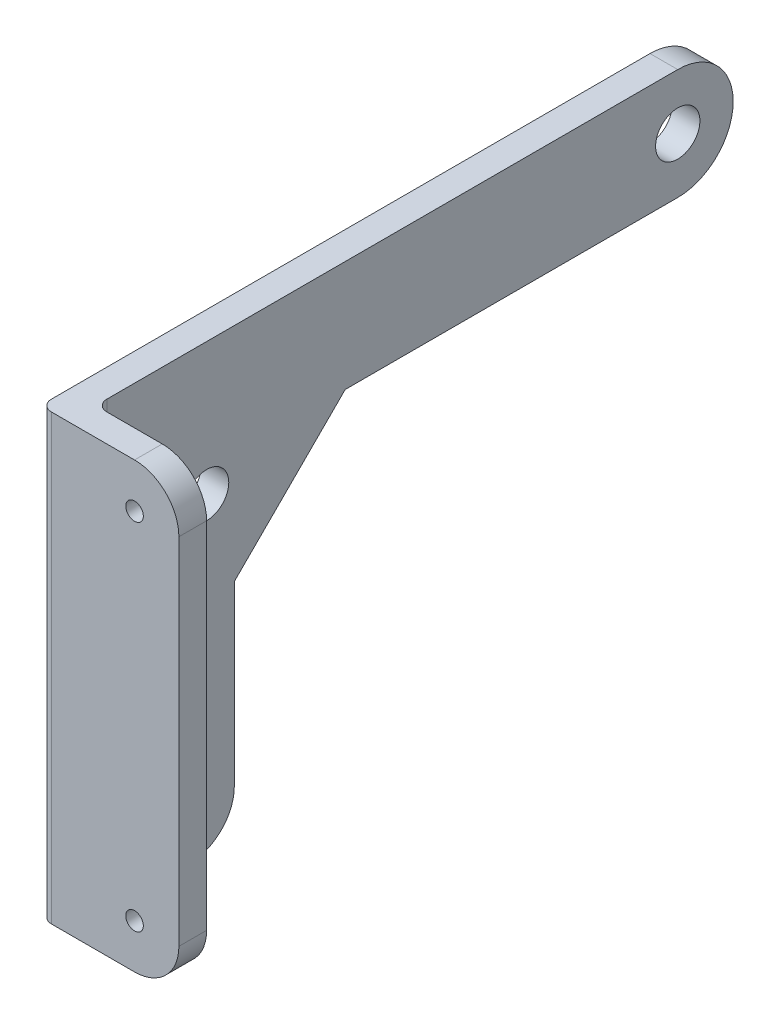
ISO-10303-21;
HEADER;
FILE_DESCRIPTION(('STEP AP214'),'2;1');
FILE_NAME('part.step','',(''),(''),'','','');
FILE_SCHEMA(('AUTOMOTIVE_DESIGN { 1 0 10303 214 1 1 1 1 }'));
ENDSEC;
DATA;
#1=APPLICATION_CONTEXT('core data for automotive mechanical design processes');
#2=APPLICATION_PROTOCOL_DEFINITION('international standard','automotive_design',2000,#1);
#3=PRODUCT_CONTEXT('',#1,'mechanical');
#4=PRODUCT('Part','Part','',(#3));
#5=PRODUCT_RELATED_PRODUCT_CATEGORY('part','',(#4));
#6=PRODUCT_DEFINITION_FORMATION('','',#4);
#7=PRODUCT_DEFINITION_CONTEXT('part definition',#1,'design');
#8=PRODUCT_DEFINITION('design','',#6,#7);
#9=PRODUCT_DEFINITION_SHAPE('','',#8);
#10=(LENGTH_UNIT() NAMED_UNIT(*) SI_UNIT(.MILLI.,.METRE.));
#11=(NAMED_UNIT(*) PLANE_ANGLE_UNIT() SI_UNIT($,.RADIAN.));
#12=(NAMED_UNIT(*) SI_UNIT($,.STERADIAN.) SOLID_ANGLE_UNIT());
#13=UNCERTAINTY_MEASURE_WITH_UNIT(LENGTH_MEASURE(1.E-05),#10,'distance_accuracy_value','');
#14=(GEOMETRIC_REPRESENTATION_CONTEXT(3) GLOBAL_UNCERTAINTY_ASSIGNED_CONTEXT((#13)) GLOBAL_UNIT_ASSIGNED_CONTEXT((#10,
#11,#12)) REPRESENTATION_CONTEXT('',''));
#15=CARTESIAN_POINT('',(0.,0.,0.));
#16=DIRECTION('',(0.,0.,1.));
#17=DIRECTION('',(1.,0.,0.));
#18=AXIS2_PLACEMENT_3D('',#15,#16,#17);
#19=CARTESIAN_POINT('',(12.5,0.,0.));
#20=DIRECTION('',(-1.,0.,0.));
#21=DIRECTION('',(0.,0.,1.));
#22=AXIS2_PLACEMENT_3D('',#19,#20,#21);
#23=PLANE('',#22);
#24=CARTESIAN_POINT('',(12.5,-70.,425.));
#25=DIRECTION('',(1.,0.,0.));
#26=DIRECTION('',(0.,0.,-1.));
#27=AXIS2_PLACEMENT_3D('',#24,#25,#26);
#28=CIRCLE('',#27,20.);
#29=CARTESIAN_POINT('',(12.5,-70.,405.));
#30=VERTEX_POINT('',#29);
#31=EDGE_CURVE('E355',#30,#30,#28,.T.);
#32=ORIENTED_EDGE('',*,*,#31,.F.);
#33=EDGE_LOOP('',(#32));
#34=FACE_BOUND('',#33,.T.);
#35=CARTESIAN_POINT('',(12.5,0.,0.));
#36=DIRECTION('',(1.,0.,0.));
#37=DIRECTION('',(0.,0.,-1.));
#38=AXIS2_PLACEMENT_3D('',#35,#36,#37);
#39=CIRCLE('',#38,20.);
#40=CARTESIAN_POINT('',(12.5,0.,-20.));
#41=VERTEX_POINT('',#40);
#42=EDGE_CURVE('E265',#41,#41,#39,.T.);
#43=ORIENTED_EDGE('',*,*,#42,.F.);
#44=EDGE_LOOP('',(#43));
#45=FACE_BOUND('',#44,.T.);
#46=DIRECTION('',(0.,0.,1.));
#47=VECTOR('',#46,1.);
#48=CARTESIAN_POINT('',(12.5,50.,0.));
#49=LINE('',#48,#47);
#50=CARTESIAN_POINT('',(12.5,50.,0.));
#51=VERTEX_POINT('',#50);
#52=CARTESIAN_POINT('',(12.5,50.0000000000001,515.));
#53=VERTEX_POINT('',#52);
#54=EDGE_CURVE('E129',#51,#53,#49,.T.);
#55=ORIENTED_EDGE('',*,*,#54,.T.);
#56=DIRECTION('',(0.,1.,0.));
#57=VECTOR('',#56,1.);
#58=CARTESIAN_POINT('',(12.5,-350.,515.));
#59=LINE('',#58,#57);
#60=CARTESIAN_POINT('',(12.5,-350.,515.));
#61=VERTEX_POINT('',#60);
#62=EDGE_CURVE('E185',#53,#61,#59,.F.);
#63=ORIENTED_EDGE('',*,*,#62,.T.);
#64=DIRECTION('',(0.,0.,-1.));
#65=VECTOR('',#64,1.);
#66=CARTESIAN_POINT('',(12.5,-350.,400.));
#67=LINE('',#66,#65);
#68=CARTESIAN_POINT('',(12.5,-350.,440.));
#69=VERTEX_POINT('',#68);
#70=EDGE_CURVE('E137',#61,#69,#67,.T.);
#71=ORIENTED_EDGE('',*,*,#70,.T.);
#72=CARTESIAN_POINT('',(12.5,-310.,440.));
#73=DIRECTION('',(-1.,0.,0.));
#74=DIRECTION('',(0.,0.,1.));
#75=AXIS2_PLACEMENT_3D('',#72,#73,#74);
#76=CIRCLE('',#75,40.);
#77=CARTESIAN_POINT('',(12.5,-310.,400.));
#78=VERTEX_POINT('',#77);
#79=EDGE_CURVE('E267',#69,#78,#76,.F.);
#80=ORIENTED_EDGE('',*,*,#79,.T.);
#81=DIRECTION('',(0.,1.,0.));
#82=VECTOR('',#81,1.);
#83=CARTESIAN_POINT('',(12.5,-50.,400.));
#84=LINE('',#83,#82);
#85=CARTESIAN_POINT('',(12.5,-150.,400.));
#86=VERTEX_POINT('',#85);
#87=EDGE_CURVE('E170',#78,#86,#84,.T.);
#88=ORIENTED_EDGE('',*,*,#87,.T.);
#89=DIRECTION('',(0.,-0.707106781186544,0.707106781186551));
#90=VECTOR('',#89,1.);
#91=CARTESIAN_POINT('',(12.5,124.999999999999,124.999999999998));
#92=LINE('',#91,#90);
#93=CARTESIAN_POINT('',(12.5,-50.,299.999999999999));
#94=VERTEX_POINT('',#93);
#95=EDGE_CURVE('E240',#86,#94,#92,.F.);
#96=ORIENTED_EDGE('',*,*,#95,.T.);
#97=DIRECTION('',(0.,0.,-1.));
#98=VECTOR('',#97,1.);
#99=CARTESIAN_POINT('',(12.5,-50.,0.));
#100=LINE('',#99,#98);
#101=CARTESIAN_POINT('',(12.5,-50.,0.));
#102=VERTEX_POINT('',#101);
#103=EDGE_CURVE('E142',#94,#102,#100,.T.);
#104=ORIENTED_EDGE('',*,*,#103,.T.);
#105=CARTESIAN_POINT('',(12.5,0.,0.));
#106=DIRECTION('',(1.,0.,0.));
#107=DIRECTION('',(0.,0.,1.));
#108=AXIS2_PLACEMENT_3D('',#105,#106,#107);
#109=CIRCLE('',#108,50.);
#110=EDGE_CURVE('E138',#102,#51,#109,.T.);
#111=ORIENTED_EDGE('',*,*,#110,.T.);
#112=EDGE_LOOP('',(#55,#63,#71,#80,#88,#96,#104,#111));
#113=FACE_BOUND('',#112,.T.);
#114=ADVANCED_FACE('F32',(#34,#45,#113),#23,.F.);
#115=CARTESIAN_POINT('',(-12.5,0.,0.));
#116=DIRECTION('',(-1.,0.,0.));
#117=DIRECTION('',(0.,0.,1.));
#118=AXIS2_PLACEMENT_3D('',#115,#116,#117);
#119=PLANE('',#118);
#120=CARTESIAN_POINT('',(-12.5,0.,0.));
#121=DIRECTION('',(1.,0.,0.));
#122=DIRECTION('',(0.,0.,-1.));
#123=AXIS2_PLACEMENT_3D('',#120,#121,#122);
#124=CIRCLE('',#123,20.);
#125=CARTESIAN_POINT('',(-12.5,0.,-20.));
#126=VERTEX_POINT('',#125);
#127=EDGE_CURVE('E358',#126,#126,#124,.T.);
#128=ORIENTED_EDGE('',*,*,#127,.T.);
#129=EDGE_LOOP('',(#128));
#130=FACE_BOUND('',#129,.T.);
#131=DIRECTION('',(0.,0.,-1.));
#132=VECTOR('',#131,1.);
#133=CARTESIAN_POINT('',(-12.5,-350.,400.));
#134=LINE('',#133,#132);
#135=CARTESIAN_POINT('',(-12.5,-350.,540.));
#136=VERTEX_POINT('',#135);
#137=CARTESIAN_POINT('',(-12.5,-350.,440.));
#138=VERTEX_POINT('',#137);
#139=EDGE_CURVE('E261',#136,#138,#134,.T.);
#140=ORIENTED_EDGE('',*,*,#139,.F.);
#141=DIRECTION('',(0.,-1.,0.));
#142=VECTOR('',#141,1.);
#143=CARTESIAN_POINT('',(-12.5,50.,540.));
#144=LINE('',#143,#142);
#145=CARTESIAN_POINT('',(-12.5,50.0000000000001,540.));
#146=VERTEX_POINT('',#145);
#147=EDGE_CURVE('E179',#136,#146,#144,.F.);
#148=ORIENTED_EDGE('',*,*,#147,.T.);
#149=DIRECTION('',(0.,0.,1.));
#150=VECTOR('',#149,1.);
#151=CARTESIAN_POINT('',(-12.5,50.,0.));
#152=LINE('',#151,#150);
#153=CARTESIAN_POINT('',(-12.5,50.,0.));
#154=VERTEX_POINT('',#153);
#155=EDGE_CURVE('E263',#154,#146,#152,.T.);
#156=ORIENTED_EDGE('',*,*,#155,.F.);
#157=CARTESIAN_POINT('',(-12.5,0.,0.));
#158=DIRECTION('',(1.,0.,0.));
#159=DIRECTION('',(0.,0.,1.));
#160=AXIS2_PLACEMENT_3D('',#157,#158,#159);
#161=CIRCLE('',#160,50.);
#162=CARTESIAN_POINT('',(-12.5,-50.,0.));
#163=VERTEX_POINT('',#162);
#164=EDGE_CURVE('E150',#163,#154,#161,.T.);
#165=ORIENTED_EDGE('',*,*,#164,.F.);
#166=DIRECTION('',(0.,0.,-1.));
#167=VECTOR('',#166,1.);
#168=CARTESIAN_POINT('',(-12.5,-50.,0.));
#169=LINE('',#168,#167);
#170=CARTESIAN_POINT('',(-12.5,-50.,299.999999999999));
#171=VERTEX_POINT('',#170);
#172=EDGE_CURVE('E146',#171,#163,#169,.T.);
#173=ORIENTED_EDGE('',*,*,#172,.F.);
#174=DIRECTION('',(0.,0.707106781186544,-0.707106781186551));
#175=VECTOR('',#174,1.);
#176=CARTESIAN_POINT('',(-12.5,-50.,299.999999999999));
#177=LINE('',#176,#175);
#178=CARTESIAN_POINT('',(-12.5,-150.,400.));
#179=VERTEX_POINT('',#178);
#180=EDGE_CURVE('E239',#171,#179,#177,.F.);
#181=ORIENTED_EDGE('',*,*,#180,.T.);
#182=DIRECTION('',(0.,1.,0.));
#183=VECTOR('',#182,1.);
#184=CARTESIAN_POINT('',(-12.5,-50.,400.));
#185=LINE('',#184,#183);
#186=CARTESIAN_POINT('',(-12.5,-310.,400.));
#187=VERTEX_POINT('',#186);
#188=EDGE_CURVE('E258',#187,#179,#185,.T.);
#189=ORIENTED_EDGE('',*,*,#188,.F.);
#190=CARTESIAN_POINT('',(-12.5,-310.,440.));
#191=DIRECTION('',(-1.,0.,0.));
#192=DIRECTION('',(0.,0.,1.));
#193=AXIS2_PLACEMENT_3D('',#190,#191,#192);
#194=CIRCLE('',#193,40.);
#195=EDGE_CURVE('E155',#187,#138,#194,.T.);
#196=ORIENTED_EDGE('',*,*,#195,.T.);
#197=EDGE_LOOP('',(#140,#148,#156,#165,#173,#181,#189,#196));
#198=FACE_BOUND('',#197,.T.);
#199=CARTESIAN_POINT('',(-12.5,-70.,425.));
#200=DIRECTION('',(1.,0.,0.));
#201=DIRECTION('',(0.,0.,-1.));
#202=AXIS2_PLACEMENT_3D('',#199,#200,#201);
#203=CIRCLE('',#202,20.);
#204=CARTESIAN_POINT('',(-12.5,-70.,405.));
#205=VERTEX_POINT('',#204);
#206=EDGE_CURVE('E208',#205,#205,#203,.T.);
#207=ORIENTED_EDGE('',*,*,#206,.T.);
#208=EDGE_LOOP('',(#207));
#209=FACE_BOUND('',#208,.T.);
#210=ADVANCED_FACE('F278',(#130,#198,#209),#119,.T.);
#211=CARTESIAN_POINT('',(12.5,0.,0.));
#212=DIRECTION('',(-1.,0.,0.));
#213=DIRECTION('',(0.,0.,1.));
#214=AXIS2_PLACEMENT_3D('',#211,#212,#213);
#215=CYLINDRICAL_SURFACE('',#214,50.);
#216=ORIENTED_EDGE('',*,*,#164,.T.);
#217=DIRECTION('',(-1.,0.,0.));
#218=VECTOR('',#217,1.);
#219=CARTESIAN_POINT('',(12.5,50.,0.));
#220=LINE('',#219,#218);
#221=EDGE_CURVE('E134',#51,#154,#220,.T.);
#222=ORIENTED_EDGE('',*,*,#221,.F.);
#223=ORIENTED_EDGE('',*,*,#110,.F.);
#224=DIRECTION('',(-1.,0.,0.));
#225=VECTOR('',#224,1.);
#226=CARTESIAN_POINT('',(12.5,-50.,0.));
#227=LINE('',#226,#225);
#228=EDGE_CURVE('E254',#102,#163,#227,.T.);
#229=ORIENTED_EDGE('',*,*,#228,.T.);
#230=EDGE_LOOP('',(#216,#222,#223,#229));
#231=FACE_BOUND('',#230,.T.);
#232=ADVANCED_FACE('F148',(#231),#215,.T.);
#233=CARTESIAN_POINT('',(12.5,50.,0.));
#234=DIRECTION('',(0.,-1.,0.));
#235=DIRECTION('',(0.,0.,-1.));
#236=AXIS2_PLACEMENT_3D('',#233,#234,#235);
#237=PLANE('',#236);
#238=ORIENTED_EDGE('',*,*,#155,.T.);
#239=CARTESIAN_POINT('',(-2.5,50.,540.));
#240=DIRECTION('',(0.,-1.,0.));
#241=DIRECTION('',(0.,0.,-1.));
#242=AXIS2_PLACEMENT_3D('',#239,#240,#241);
#243=CIRCLE('',#242,10.);
#244=CARTESIAN_POINT('',(-2.5,50.0000000000001,550.));
#245=VERTEX_POINT('',#244);
#246=EDGE_CURVE('E181',#146,#245,#243,.F.);
#247=ORIENTED_EDGE('',*,*,#246,.T.);
#248=DIRECTION('',(-1.,0.,0.));
#249=VECTOR('',#248,1.);
#250=CARTESIAN_POINT('',(12.5,50.0000000000001,550.));
#251=LINE('',#250,#249);
#252=CARTESIAN_POINT('',(72.5,50.0000000000001,550.));
#253=VERTEX_POINT('',#252);
#254=EDGE_CURVE('E152',#253,#245,#251,.T.);
#255=ORIENTED_EDGE('',*,*,#254,.F.);
#256=DIRECTION('',(0.,0.,1.));
#257=VECTOR('',#256,1.);
#258=CARTESIAN_POINT('',(72.5,50.0000000000001,525.));
#259=LINE('',#258,#257);
#260=CARTESIAN_POINT('',(72.5,50.0000000000001,525.));
#261=VERTEX_POINT('',#260);
#262=EDGE_CURVE('E205',#253,#261,#259,.F.);
#263=ORIENTED_EDGE('',*,*,#262,.T.);
#264=DIRECTION('',(-1.,0.,0.));
#265=VECTOR('',#264,1.);
#266=CARTESIAN_POINT('',(112.5,50.0000000000001,525.));
#267=LINE('',#266,#265);
#268=CARTESIAN_POINT('',(22.5,50.0000000000001,525.));
#269=VERTEX_POINT('',#268);
#270=EDGE_CURVE('E200',#261,#269,#267,.T.);
#271=ORIENTED_EDGE('',*,*,#270,.T.);
#272=CARTESIAN_POINT('',(22.5,50.0000000000001,515.));
#273=DIRECTION('',(0.,-1.,0.));
#274=DIRECTION('',(0.,0.,-1.));
#275=AXIS2_PLACEMENT_3D('',#272,#273,#274);
#276=CIRCLE('',#275,10.);
#277=EDGE_CURVE('E40',#269,#53,#276,.T.);
#278=ORIENTED_EDGE('',*,*,#277,.T.);
#279=ORIENTED_EDGE('',*,*,#54,.F.);
#280=ORIENTED_EDGE('',*,*,#221,.T.);
#281=EDGE_LOOP('',(#238,#247,#255,#263,#271,#278,#279,#280));
#282=FACE_BOUND('',#281,.T.);
#283=ADVANCED_FACE('F132',(#282),#237,.F.);
#284=CARTESIAN_POINT('',(12.5,-350.,550.));
#285=DIRECTION('',(0.,0.,-1.));
#286=DIRECTION('',(-1.,0.,0.));
#287=AXIS2_PLACEMENT_3D('',#284,#285,#286);
#288=PLANE('',#287);
#289=CARTESIAN_POINT('',(72.5,10.0000000000001,550.));
#290=DIRECTION('',(0.,0.,1.));
#291=DIRECTION('',(1.,0.,0.));
#292=AXIS2_PLACEMENT_3D('',#289,#290,#291);
#293=CIRCLE('',#292,7.93749999999999);
#294=CARTESIAN_POINT('',(80.4375,10.0000000000001,550.));
#295=VERTEX_POINT('',#294);
#296=EDGE_CURVE('E234',#295,#295,#293,.T.);
#297=ORIENTED_EDGE('',*,*,#296,.F.);
#298=EDGE_LOOP('',(#297));
#299=FACE_BOUND('',#298,.T.);
#300=CARTESIAN_POINT('',(72.5,-310.,550.));
#301=DIRECTION('',(0.,0.,1.));
#302=DIRECTION('',(1.,0.,0.));
#303=AXIS2_PLACEMENT_3D('',#300,#301,#302);
#304=CIRCLE('',#303,7.93749999999999);
#305=CARTESIAN_POINT('',(80.4375,-310.,550.));
#306=VERTEX_POINT('',#305);
#307=EDGE_CURVE('E230',#306,#306,#304,.T.);
#308=ORIENTED_EDGE('',*,*,#307,.F.);
#309=EDGE_LOOP('',(#308));
#310=FACE_BOUND('',#309,.T.);
#311=ORIENTED_EDGE('',*,*,#254,.T.);
#312=DIRECTION('',(0.,-1.,0.));
#313=VECTOR('',#312,1.);
#314=CARTESIAN_POINT('',(-2.5,-350.,550.));
#315=LINE('',#314,#313);
#316=CARTESIAN_POINT('',(-2.5,-350.,550.));
#317=VERTEX_POINT('',#316);
#318=EDGE_CURVE('E175',#245,#317,#315,.T.);
#319=ORIENTED_EDGE('',*,*,#318,.T.);
#320=DIRECTION('',(-1.,0.,0.));
#321=VECTOR('',#320,1.);
#322=CARTESIAN_POINT('',(12.5,-350.,550.));
#323=LINE('',#322,#321);
#324=CARTESIAN_POINT('',(72.5,-350.,550.));
#325=VERTEX_POINT('',#324);
#326=EDGE_CURVE('E158',#325,#317,#323,.T.);
#327=ORIENTED_EDGE('',*,*,#326,.F.);
#328=CARTESIAN_POINT('',(72.5,-310.,550.));
#329=DIRECTION('',(0.,0.,-1.));
#330=DIRECTION('',(-1.,0.,0.));
#331=AXIS2_PLACEMENT_3D('',#328,#329,#330);
#332=CIRCLE('',#331,40.);
#333=CARTESIAN_POINT('',(112.5,-310.,550.));
#334=VERTEX_POINT('',#333);
#335=EDGE_CURVE('E223',#325,#334,#332,.F.);
#336=ORIENTED_EDGE('',*,*,#335,.T.);
#337=DIRECTION('',(0.,-1.,0.));
#338=VECTOR('',#337,1.);
#339=CARTESIAN_POINT('',(112.5,50.0000000000001,550.));
#340=LINE('',#339,#338);
#341=CARTESIAN_POINT('',(112.5,10.0000000000001,550.));
#342=VERTEX_POINT('',#341);
#343=EDGE_CURVE('E211',#342,#334,#340,.T.);
#344=ORIENTED_EDGE('',*,*,#343,.F.);
#345=CARTESIAN_POINT('',(72.5,10.0000000000001,550.));
#346=DIRECTION('',(0.,0.,-1.));
#347=DIRECTION('',(-1.,0.,0.));
#348=AXIS2_PLACEMENT_3D('',#345,#346,#347);
#349=CIRCLE('',#348,40.);
#350=EDGE_CURVE('E221',#342,#253,#349,.F.);
#351=ORIENTED_EDGE('',*,*,#350,.T.);
#352=EDGE_LOOP('',(#311,#319,#327,#336,#344,#351));
#353=FACE_BOUND('',#352,.T.);
#354=ADVANCED_FACE('F247',(#299,#310,#353),#288,.F.);
#355=CARTESIAN_POINT('',(12.5,-350.,400.));
#356=DIRECTION('',(0.,1.,0.));
#357=DIRECTION('',(0.,0.,1.));
#358=AXIS2_PLACEMENT_3D('',#355,#356,#357);
#359=PLANE('',#358);
#360=ORIENTED_EDGE('',*,*,#326,.T.);
#361=CARTESIAN_POINT('',(-2.5,-350.,540.));
#362=DIRECTION('',(0.,1.,0.));
#363=DIRECTION('',(0.,0.,1.));
#364=AXIS2_PLACEMENT_3D('',#361,#362,#363);
#365=CIRCLE('',#364,10.);
#366=EDGE_CURVE('E177',#317,#136,#365,.F.);
#367=ORIENTED_EDGE('',*,*,#366,.T.);
#368=ORIENTED_EDGE('',*,*,#139,.T.);
#369=DIRECTION('',(-1.,0.,0.));
#370=VECTOR('',#369,1.);
#371=CARTESIAN_POINT('',(12.5,-350.,440.));
#372=LINE('',#371,#370);
#373=EDGE_CURVE('E195',#138,#69,#372,.F.);
#374=ORIENTED_EDGE('',*,*,#373,.T.);
#375=ORIENTED_EDGE('',*,*,#70,.F.);
#376=CARTESIAN_POINT('',(22.5,-350.,515.));
#377=DIRECTION('',(0.,1.,0.));
#378=DIRECTION('',(0.,0.,1.));
#379=AXIS2_PLACEMENT_3D('',#376,#377,#378);
#380=CIRCLE('',#379,10.);
#381=CARTESIAN_POINT('',(22.5,-350.,525.));
#382=VERTEX_POINT('',#381);
#383=EDGE_CURVE('E11',#61,#382,#380,.T.);
#384=ORIENTED_EDGE('',*,*,#383,.T.);
#385=DIRECTION('',(-1.,0.,0.));
#386=VECTOR('',#385,1.);
#387=CARTESIAN_POINT('',(112.5,-350.,525.));
#388=LINE('',#387,#386);
#389=CARTESIAN_POINT('',(72.5,-350.,525.));
#390=VERTEX_POINT('',#389);
#391=EDGE_CURVE('E202',#390,#382,#388,.T.);
#392=ORIENTED_EDGE('',*,*,#391,.F.);
#393=DIRECTION('',(0.,0.,-1.));
#394=VECTOR('',#393,1.);
#395=CARTESIAN_POINT('',(72.5,-350.,550.));
#396=LINE('',#395,#394);
#397=EDGE_CURVE('E253',#390,#325,#396,.F.);
#398=ORIENTED_EDGE('',*,*,#397,.T.);
#399=EDGE_LOOP('',(#360,#367,#368,#374,#375,#384,#392,#398));
#400=FACE_BOUND('',#399,.T.);
#401=ADVANCED_FACE('F191',(#400),#359,.F.);
#402=CARTESIAN_POINT('',(12.5,-50.,400.));
#403=DIRECTION('',(0.,0.,1.));
#404=DIRECTION('',(0.,-1.,0.));
#405=AXIS2_PLACEMENT_3D('',#402,#403,#404);
#406=PLANE('',#405);
#407=ORIENTED_EDGE('',*,*,#188,.T.);
#408=DIRECTION('',(1.,0.,0.));
#409=VECTOR('',#408,1.);
#410=CARTESIAN_POINT('',(12.5,-150.,400.));
#411=LINE('',#410,#409);
#412=EDGE_CURVE('E237',#179,#86,#411,.T.);
#413=ORIENTED_EDGE('',*,*,#412,.T.);
#414=ORIENTED_EDGE('',*,*,#87,.F.);
#415=DIRECTION('',(-1.,0.,0.));
#416=VECTOR('',#415,1.);
#417=CARTESIAN_POINT('',(12.5,-310.,400.));
#418=LINE('',#417,#416);
#419=EDGE_CURVE('E151',#78,#187,#418,.T.);
#420=ORIENTED_EDGE('',*,*,#419,.T.);
#421=EDGE_LOOP('',(#407,#413,#414,#420));
#422=FACE_BOUND('',#421,.T.);
#423=ADVANCED_FACE('F306',(#422),#406,.F.);
#424=CARTESIAN_POINT('',(12.5,-50.,0.));
#425=DIRECTION('',(0.,1.,0.));
#426=DIRECTION('',(0.,0.,1.));
#427=AXIS2_PLACEMENT_3D('',#424,#425,#426);
#428=PLANE('',#427);
#429=ORIENTED_EDGE('',*,*,#103,.F.);
#430=DIRECTION('',(-1.,0.,0.));
#431=VECTOR('',#430,1.);
#432=CARTESIAN_POINT('',(-12.5,-50.,299.999999999999));
#433=LINE('',#432,#431);
#434=EDGE_CURVE('E226',#94,#171,#433,.T.);
#435=ORIENTED_EDGE('',*,*,#434,.T.);
#436=ORIENTED_EDGE('',*,*,#172,.T.);
#437=ORIENTED_EDGE('',*,*,#228,.F.);
#438=EDGE_LOOP('',(#429,#435,#436,#437));
#439=FACE_BOUND('',#438,.T.);
#440=ADVANCED_FACE('F276',(#439),#428,.F.);
#441=CARTESIAN_POINT('',(12.5,0.,0.));
#442=DIRECTION('',(-1.,0.,0.));
#443=DIRECTION('',(0.,0.,1.));
#444=AXIS2_PLACEMENT_3D('',#441,#442,#443);
#445=CYLINDRICAL_SURFACE('',#444,20.);
#446=ORIENTED_EDGE('',*,*,#42,.T.);
#447=EDGE_LOOP('',(#446));
#448=FACE_BOUND('',#447,.T.);
#449=ORIENTED_EDGE('',*,*,#127,.F.);
#450=EDGE_LOOP('',(#449));
#451=FACE_BOUND('',#450,.T.);
#452=ADVANCED_FACE('F301',(#448,#451),#445,.F.);
#453=CARTESIAN_POINT('',(12.5,-70.,425.));
#454=DIRECTION('',(-1.,0.,0.));
#455=DIRECTION('',(0.,0.,1.));
#456=AXIS2_PLACEMENT_3D('',#453,#454,#455);
#457=CYLINDRICAL_SURFACE('',#456,20.);
#458=ORIENTED_EDGE('',*,*,#31,.T.);
#459=EDGE_LOOP('',(#458));
#460=FACE_BOUND('',#459,.T.);
#461=ORIENTED_EDGE('',*,*,#206,.F.);
#462=EDGE_LOOP('',(#461));
#463=FACE_BOUND('',#462,.T.);
#464=ADVANCED_FACE('F366',(#460,#463),#457,.F.);
#465=CARTESIAN_POINT('',(112.5,50.0000000000001,525.));
#466=DIRECTION('',(0.,0.,1.));
#467=DIRECTION('',(1.,0.,0.));
#468=AXIS2_PLACEMENT_3D('',#465,#466,#467);
#469=PLANE('',#468);
#470=CARTESIAN_POINT('',(72.5,10.0000000000001,525.));
#471=DIRECTION('',(0.,0.,1.));
#472=DIRECTION('',(1.,0.,0.));
#473=AXIS2_PLACEMENT_3D('',#470,#471,#472);
#474=CIRCLE('',#473,7.93749999999996);
#475=CARTESIAN_POINT('',(80.4375,10.0000000000001,525.));
#476=VERTEX_POINT('',#475);
#477=EDGE_CURVE('E231',#476,#476,#474,.T.);
#478=ORIENTED_EDGE('',*,*,#477,.T.);
#479=EDGE_LOOP('',(#478));
#480=FACE_BOUND('',#479,.T.);
#481=CARTESIAN_POINT('',(72.5,-310.,525.));
#482=DIRECTION('',(0.,0.,1.));
#483=DIRECTION('',(1.,0.,0.));
#484=AXIS2_PLACEMENT_3D('',#481,#482,#483);
#485=CIRCLE('',#484,7.93749999999996);
#486=CARTESIAN_POINT('',(80.4375,-310.,525.));
#487=VERTEX_POINT('',#486);
#488=EDGE_CURVE('E227',#487,#487,#485,.T.);
#489=ORIENTED_EDGE('',*,*,#488,.T.);
#490=EDGE_LOOP('',(#489));
#491=FACE_BOUND('',#490,.T.);
#492=ORIENTED_EDGE('',*,*,#391,.T.);
#493=DIRECTION('',(0.,1.,0.));
#494=VECTOR('',#493,1.);
#495=CARTESIAN_POINT('',(22.5,50.0000000000001,525.));
#496=LINE('',#495,#494);
#497=EDGE_CURVE('E183',#382,#269,#496,.T.);
#498=ORIENTED_EDGE('',*,*,#497,.T.);
#499=ORIENTED_EDGE('',*,*,#270,.F.);
#500=CARTESIAN_POINT('',(72.5,10.0000000000001,525.));
#501=DIRECTION('',(0.,0.,1.));
#502=DIRECTION('',(1.,0.,0.));
#503=AXIS2_PLACEMENT_3D('',#500,#501,#502);
#504=CIRCLE('',#503,40.);
#505=CARTESIAN_POINT('',(112.5,10.0000000000001,525.));
#506=VERTEX_POINT('',#505);
#507=EDGE_CURVE('E217',#261,#506,#504,.F.);
#508=ORIENTED_EDGE('',*,*,#507,.T.);
#509=DIRECTION('',(0.,1.,0.));
#510=VECTOR('',#509,1.);
#511=CARTESIAN_POINT('',(112.5,50.0000000000001,525.));
#512=LINE('',#511,#510);
#513=CARTESIAN_POINT('',(112.5,-310.,525.));
#514=VERTEX_POINT('',#513);
#515=EDGE_CURVE('E206',#514,#506,#512,.T.);
#516=ORIENTED_EDGE('',*,*,#515,.F.);
#517=CARTESIAN_POINT('',(72.5,-310.,525.));
#518=DIRECTION('',(0.,0.,1.));
#519=DIRECTION('',(1.,0.,0.));
#520=AXIS2_PLACEMENT_3D('',#517,#518,#519);
#521=CIRCLE('',#520,40.);
#522=EDGE_CURVE('E219',#514,#390,#521,.F.);
#523=ORIENTED_EDGE('',*,*,#522,.T.);
#524=EDGE_LOOP('',(#492,#498,#499,#508,#516,#523));
#525=FACE_BOUND('',#524,.T.);
#526=ADVANCED_FACE('F199',(#480,#491,#525),#469,.F.);
#527=CARTESIAN_POINT('',(112.5,-350.,550.));
#528=DIRECTION('',(1.,0.,0.));
#529=DIRECTION('',(0.,0.,-1.));
#530=AXIS2_PLACEMENT_3D('',#527,#528,#529);
#531=PLANE('',#530);
#532=ORIENTED_EDGE('',*,*,#343,.T.);
#533=DIRECTION('',(0.,0.,-1.));
#534=VECTOR('',#533,1.);
#535=CARTESIAN_POINT('',(112.5,-310.,525.));
#536=LINE('',#535,#534);
#537=EDGE_CURVE('E215',#334,#514,#536,.T.);
#538=ORIENTED_EDGE('',*,*,#537,.T.);
#539=ORIENTED_EDGE('',*,*,#515,.T.);
#540=DIRECTION('',(0.,0.,1.));
#541=VECTOR('',#540,1.);
#542=CARTESIAN_POINT('',(112.5,10.0000000000001,550.));
#543=LINE('',#542,#541);
#544=EDGE_CURVE('E338',#506,#342,#543,.T.);
#545=ORIENTED_EDGE('',*,*,#544,.T.);
#546=EDGE_LOOP('',(#532,#538,#539,#545));
#547=FACE_BOUND('',#546,.T.);
#548=ADVANCED_FACE('F322',(#547),#531,.T.);
#549=CARTESIAN_POINT('',(12.5,-310.,440.));
#550=DIRECTION('',(-1.,0.,0.));
#551=DIRECTION('',(0.,0.,1.));
#552=AXIS2_PLACEMENT_3D('',#549,#550,#551);
#553=CYLINDRICAL_SURFACE('',#552,40.);
#554=ORIENTED_EDGE('',*,*,#79,.F.);
#555=ORIENTED_EDGE('',*,*,#373,.F.);
#556=ORIENTED_EDGE('',*,*,#195,.F.);
#557=ORIENTED_EDGE('',*,*,#419,.F.);
#558=EDGE_LOOP('',(#554,#555,#556,#557));
#559=FACE_BOUND('',#558,.T.);
#560=ADVANCED_FACE('F318',(#559),#553,.T.);
#561=CARTESIAN_POINT('',(72.5,-310.,550.));
#562=DIRECTION('',(0.,0.,1.));
#563=DIRECTION('',(1.,0.,0.));
#564=AXIS2_PLACEMENT_3D('',#561,#562,#563);
#565=CYLINDRICAL_SURFACE('',#564,40.);
#566=ORIENTED_EDGE('',*,*,#335,.F.);
#567=ORIENTED_EDGE('',*,*,#397,.F.);
#568=ORIENTED_EDGE('',*,*,#522,.F.);
#569=ORIENTED_EDGE('',*,*,#537,.F.);
#570=EDGE_LOOP('',(#566,#567,#568,#569));
#571=FACE_BOUND('',#570,.T.);
#572=ADVANCED_FACE('F321',(#571),#565,.T.);
#573=CARTESIAN_POINT('',(72.5,10.0000000000001,550.));
#574=DIRECTION('',(0.,0.,-1.));
#575=DIRECTION('',(0.,1.,0.));
#576=AXIS2_PLACEMENT_3D('',#573,#574,#575);
#577=CYLINDRICAL_SURFACE('',#576,40.);
#578=ORIENTED_EDGE('',*,*,#507,.F.);
#579=ORIENTED_EDGE('',*,*,#262,.F.);
#580=ORIENTED_EDGE('',*,*,#350,.F.);
#581=ORIENTED_EDGE('',*,*,#544,.F.);
#582=EDGE_LOOP('',(#578,#579,#580,#581));
#583=FACE_BOUND('',#582,.T.);
#584=ADVANCED_FACE('F326',(#583),#577,.T.);
#585=CARTESIAN_POINT('',(72.5,-310.,550.));
#586=DIRECTION('',(0.,0.,1.));
#587=DIRECTION('',(1.,0.,0.));
#588=AXIS2_PLACEMENT_3D('',#585,#586,#587);
#589=CYLINDRICAL_SURFACE('',#588,7.93749999999996);
#590=ORIENTED_EDGE('',*,*,#307,.T.);
#591=EDGE_LOOP('',(#590));
#592=FACE_BOUND('',#591,.T.);
#593=ORIENTED_EDGE('',*,*,#488,.F.);
#594=EDGE_LOOP('',(#593));
#595=FACE_BOUND('',#594,.T.);
#596=ADVANCED_FACE('F329',(#592,#595),#589,.F.);
#597=CARTESIAN_POINT('',(72.5,10.0000000000001,550.));
#598=DIRECTION('',(0.,0.,1.));
#599=DIRECTION('',(1.,0.,0.));
#600=AXIS2_PLACEMENT_3D('',#597,#598,#599);
#601=CYLINDRICAL_SURFACE('',#600,7.93749999999996);
#602=ORIENTED_EDGE('',*,*,#296,.T.);
#603=EDGE_LOOP('',(#602));
#604=FACE_BOUND('',#603,.T.);
#605=ORIENTED_EDGE('',*,*,#477,.F.);
#606=EDGE_LOOP('',(#605));
#607=FACE_BOUND('',#606,.T.);
#608=ADVANCED_FACE('F288',(#604,#607),#601,.F.);
#609=CARTESIAN_POINT('',(12.5,-50.,299.999999999999));
#610=DIRECTION('',(0.,-0.707106781186551,-0.707106781186544));
#611=DIRECTION('',(0.,0.707106781186544,-0.707106781186551));
#612=AXIS2_PLACEMENT_3D('',#609,#610,#611);
#613=PLANE('',#612);
#614=ORIENTED_EDGE('',*,*,#95,.F.);
#615=ORIENTED_EDGE('',*,*,#412,.F.);
#616=ORIENTED_EDGE('',*,*,#180,.F.);
#617=ORIENTED_EDGE('',*,*,#434,.F.);
#618=EDGE_LOOP('',(#614,#615,#616,#617));
#619=FACE_BOUND('',#618,.T.);
#620=ADVANCED_FACE('F273',(#619),#613,.T.);
#621=CARTESIAN_POINT('',(-2.5,-350.,540.));
#622=DIRECTION('',(0.,1.,0.));
#623=DIRECTION('',(0.,0.,1.));
#624=AXIS2_PLACEMENT_3D('',#621,#622,#623);
#625=CYLINDRICAL_SURFACE('',#624,10.);
#626=ORIENTED_EDGE('',*,*,#246,.F.);
#627=ORIENTED_EDGE('',*,*,#147,.F.);
#628=ORIENTED_EDGE('',*,*,#366,.F.);
#629=ORIENTED_EDGE('',*,*,#318,.F.);
#630=EDGE_LOOP('',(#626,#627,#628,#629));
#631=FACE_BOUND('',#630,.T.);
#632=ADVANCED_FACE('F282',(#631),#625,.T.);
#633=CARTESIAN_POINT('',(22.5,50.0000000000001,515.));
#634=DIRECTION('',(0.,-1.,0.));
#635=DIRECTION('',(0.,0.,-1.));
#636=AXIS2_PLACEMENT_3D('',#633,#634,#635);
#637=CYLINDRICAL_SURFACE('',#636,10.);
#638=ORIENTED_EDGE('',*,*,#383,.F.);
#639=ORIENTED_EDGE('',*,*,#62,.F.);
#640=ORIENTED_EDGE('',*,*,#277,.F.);
#641=ORIENTED_EDGE('',*,*,#497,.F.);
#642=EDGE_LOOP('',(#638,#639,#640,#641));
#643=FACE_BOUND('',#642,.T.);
#644=ADVANCED_FACE('F34',(#643),#637,.F.);
#645=CLOSED_SHELL('',(#114,#210,#232,#283,#354,#401,#423,#440,#452,#464,#526,#548,#560,#572,
#584,#596,#608,#620,#632,#644));
#646=MANIFOLD_SOLID_BREP('B2',#645);
#647=ADVANCED_BREP_SHAPE_REPRESENTATION('',(#18,#646),#14);
#648=SHAPE_DEFINITION_REPRESENTATION(#9,#647);
ENDSEC;
END-ISO-10303-21;
